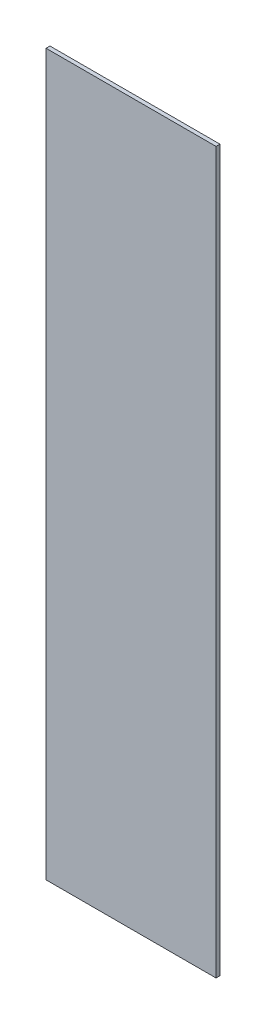
ISO-10303-21;
HEADER;
FILE_DESCRIPTION(('STEP AP214'),'2;1');
FILE_NAME('part.step','',(''),(''),'','','');
FILE_SCHEMA(('AUTOMOTIVE_DESIGN { 1 0 10303 214 1 1 1 1 }'));
ENDSEC;
DATA;
#1=APPLICATION_CONTEXT('core data for automotive mechanical design processes');
#2=APPLICATION_PROTOCOL_DEFINITION('international standard','automotive_design',2000,#1);
#3=PRODUCT_CONTEXT('',#1,'mechanical');
#4=PRODUCT('Part','Part','',(#3));
#5=PRODUCT_RELATED_PRODUCT_CATEGORY('part','',(#4));
#6=PRODUCT_DEFINITION_FORMATION('','',#4);
#7=PRODUCT_DEFINITION_CONTEXT('part definition',#1,'design');
#8=PRODUCT_DEFINITION('design','',#6,#7);
#9=PRODUCT_DEFINITION_SHAPE('','',#8);
#10=(LENGTH_UNIT() NAMED_UNIT(*) SI_UNIT(.MILLI.,.METRE.));
#11=(NAMED_UNIT(*) PLANE_ANGLE_UNIT() SI_UNIT($,.RADIAN.));
#12=(NAMED_UNIT(*) SI_UNIT($,.STERADIAN.) SOLID_ANGLE_UNIT());
#13=UNCERTAINTY_MEASURE_WITH_UNIT(LENGTH_MEASURE(1.E-05),#10,'distance_accuracy_value','');
#14=(GEOMETRIC_REPRESENTATION_CONTEXT(3) GLOBAL_UNCERTAINTY_ASSIGNED_CONTEXT((#13)) GLOBAL_UNIT_ASSIGNED_CONTEXT((#10,
#11,#12)) REPRESENTATION_CONTEXT('',''));
#15=CARTESIAN_POINT('',(0.,0.,0.));
#16=DIRECTION('',(0.,0.,1.));
#17=DIRECTION('',(1.,0.,0.));
#18=AXIS2_PLACEMENT_3D('',#15,#16,#17);
#19=CARTESIAN_POINT('',(216.75,-918.5,10.));
#20=DIRECTION('',(-1.,0.,0.));
#21=DIRECTION('',(0.,0.,1.));
#22=AXIS2_PLACEMENT_3D('',#19,#20,#21);
#23=PLANE('',#22);
#24=DIRECTION('',(0.,1.,0.));
#25=VECTOR('',#24,1.);
#26=CARTESIAN_POINT('',(216.75,-918.5,0.));
#27=LINE('',#26,#25);
#28=CARTESIAN_POINT('',(216.75,-918.5,0.));
#29=VERTEX_POINT('',#28);
#30=CARTESIAN_POINT('',(216.75,918.5,0.));
#31=VERTEX_POINT('',#30);
#32=EDGE_CURVE('E106',#29,#31,#27,.T.);
#33=ORIENTED_EDGE('',*,*,#32,.T.);
#34=DIRECTION('',(0.,0.,-1.));
#35=VECTOR('',#34,1.);
#36=CARTESIAN_POINT('',(216.75,918.5,10.));
#37=LINE('',#36,#35);
#38=CARTESIAN_POINT('',(216.75,918.5,10.));
#39=VERTEX_POINT('',#38);
#40=EDGE_CURVE('E11',#39,#31,#37,.T.);
#41=ORIENTED_EDGE('',*,*,#40,.F.);
#42=DIRECTION('',(0.,1.,0.));
#43=VECTOR('',#42,1.);
#44=CARTESIAN_POINT('',(216.75,-918.5,10.));
#45=LINE('',#44,#43);
#46=CARTESIAN_POINT('',(216.75,-918.5,10.));
#47=VERTEX_POINT('',#46);
#48=EDGE_CURVE('E94',#47,#39,#45,.T.);
#49=ORIENTED_EDGE('',*,*,#48,.F.);
#50=DIRECTION('',(0.,0.,-1.));
#51=VECTOR('',#50,1.);
#52=CARTESIAN_POINT('',(216.75,-918.5,10.));
#53=LINE('',#52,#51);
#54=EDGE_CURVE('E102',#47,#29,#53,.T.);
#55=ORIENTED_EDGE('',*,*,#54,.T.);
#56=EDGE_LOOP('',(#33,#41,#49,#55));
#57=FACE_BOUND('',#56,.T.);
#58=ADVANCED_FACE('F43',(#57),#23,.F.);
#59=CARTESIAN_POINT('',(-216.75,918.5,10.));
#60=DIRECTION('',(0.,-1.,0.));
#61=DIRECTION('',(0.,0.,-1.));
#62=AXIS2_PLACEMENT_3D('',#59,#60,#61);
#63=PLANE('',#62);
#64=DIRECTION('',(-1.,0.,0.));
#65=VECTOR('',#64,1.);
#66=CARTESIAN_POINT('',(-216.75,918.5,0.));
#67=LINE('',#66,#65);
#68=CARTESIAN_POINT('',(-216.75,918.5,0.));
#69=VERTEX_POINT('',#68);
#70=EDGE_CURVE('E98',#31,#69,#67,.T.);
#71=ORIENTED_EDGE('',*,*,#70,.T.);
#72=DIRECTION('',(0.,0.,-1.));
#73=VECTOR('',#72,1.);
#74=CARTESIAN_POINT('',(-216.75,918.5,10.));
#75=LINE('',#74,#73);
#76=CARTESIAN_POINT('',(-216.75,918.5,10.));
#77=VERTEX_POINT('',#76);
#78=EDGE_CURVE('E51',#77,#69,#75,.T.);
#79=ORIENTED_EDGE('',*,*,#78,.F.);
#80=DIRECTION('',(-1.,0.,0.));
#81=VECTOR('',#80,1.);
#82=CARTESIAN_POINT('',(-216.75,918.5,10.));
#83=LINE('',#82,#81);
#84=EDGE_CURVE('E89',#39,#77,#83,.T.);
#85=ORIENTED_EDGE('',*,*,#84,.F.);
#86=ORIENTED_EDGE('',*,*,#40,.T.);
#87=EDGE_LOOP('',(#71,#79,#85,#86));
#88=FACE_BOUND('',#87,.T.);
#89=ADVANCED_FACE('F97',(#88),#63,.F.);
#90=CARTESIAN_POINT('',(-216.75,-918.5,10.));
#91=DIRECTION('',(1.,0.,0.));
#92=DIRECTION('',(0.,0.,-1.));
#93=AXIS2_PLACEMENT_3D('',#90,#91,#92);
#94=PLANE('',#93);
#95=DIRECTION('',(0.,-1.,0.));
#96=VECTOR('',#95,1.);
#97=CARTESIAN_POINT('',(-216.75,-918.5,0.));
#98=LINE('',#97,#96);
#99=CARTESIAN_POINT('',(-216.75,-918.5,0.));
#100=VERTEX_POINT('',#99);
#101=EDGE_CURVE('E76',#69,#100,#98,.T.);
#102=ORIENTED_EDGE('',*,*,#101,.T.);
#103=DIRECTION('',(0.,0.,-1.));
#104=VECTOR('',#103,1.);
#105=CARTESIAN_POINT('',(-216.75,-918.5,10.));
#106=LINE('',#105,#104);
#107=CARTESIAN_POINT('',(-216.75,-918.5,10.));
#108=VERTEX_POINT('',#107);
#109=EDGE_CURVE('E99',#108,#100,#106,.T.);
#110=ORIENTED_EDGE('',*,*,#109,.F.);
#111=DIRECTION('',(0.,-1.,0.));
#112=VECTOR('',#111,1.);
#113=CARTESIAN_POINT('',(-216.75,-918.5,10.));
#114=LINE('',#113,#112);
#115=EDGE_CURVE('E92',#77,#108,#114,.T.);
#116=ORIENTED_EDGE('',*,*,#115,.F.);
#117=ORIENTED_EDGE('',*,*,#78,.T.);
#118=EDGE_LOOP('',(#102,#110,#116,#117));
#119=FACE_BOUND('',#118,.T.);
#120=ADVANCED_FACE('F100',(#119),#94,.F.);
#121=CARTESIAN_POINT('',(-216.75,-918.5,10.));
#122=DIRECTION('',(0.,1.,0.));
#123=DIRECTION('',(0.,0.,1.));
#124=AXIS2_PLACEMENT_3D('',#121,#122,#123);
#125=PLANE('',#124);
#126=DIRECTION('',(1.,0.,0.));
#127=VECTOR('',#126,1.);
#128=CARTESIAN_POINT('',(-216.75,-918.5,0.));
#129=LINE('',#128,#127);
#130=EDGE_CURVE('E82',#100,#29,#129,.T.);
#131=ORIENTED_EDGE('',*,*,#130,.T.);
#132=ORIENTED_EDGE('',*,*,#54,.F.);
#133=DIRECTION('',(1.,0.,0.));
#134=VECTOR('',#133,1.);
#135=CARTESIAN_POINT('',(-216.75,-918.5,10.));
#136=LINE('',#135,#134);
#137=EDGE_CURVE('E59',#108,#47,#136,.T.);
#138=ORIENTED_EDGE('',*,*,#137,.F.);
#139=ORIENTED_EDGE('',*,*,#109,.T.);
#140=EDGE_LOOP('',(#131,#132,#138,#139));
#141=FACE_BOUND('',#140,.T.);
#142=ADVANCED_FACE('F113',(#141),#125,.F.);
#143=CARTESIAN_POINT('',(0.,0.,10.));
#144=DIRECTION('',(0.,0.,-1.));
#145=DIRECTION('',(-1.,0.,0.));
#146=AXIS2_PLACEMENT_3D('',#143,#144,#145);
#147=PLANE('',#146);
#148=ORIENTED_EDGE('',*,*,#48,.T.);
#149=ORIENTED_EDGE('',*,*,#84,.T.);
#150=ORIENTED_EDGE('',*,*,#115,.T.);
#151=ORIENTED_EDGE('',*,*,#137,.T.);
#152=EDGE_LOOP('',(#148,#149,#150,#151));
#153=FACE_BOUND('',#152,.T.);
#154=ADVANCED_FACE('F90',(#153),#147,.F.);
#155=CARTESIAN_POINT('',(0.,0.,0.));
#156=DIRECTION('',(0.,0.,-1.));
#157=DIRECTION('',(-1.,0.,0.));
#158=AXIS2_PLACEMENT_3D('',#155,#156,#157);
#159=PLANE('',#158);
#160=ORIENTED_EDGE('',*,*,#32,.F.);
#161=ORIENTED_EDGE('',*,*,#130,.F.);
#162=ORIENTED_EDGE('',*,*,#101,.F.);
#163=ORIENTED_EDGE('',*,*,#70,.F.);
#164=EDGE_LOOP('',(#160,#161,#162,#163));
#165=FACE_BOUND('',#164,.T.);
#166=ADVANCED_FACE('F116',(#165),#159,.T.);
#167=CLOSED_SHELL('',(#58,#89,#120,#142,#154,#166));
#168=MANIFOLD_SOLID_BREP('B2',#167);
#169=ADVANCED_BREP_SHAPE_REPRESENTATION('',(#18,#168),#14);
#170=SHAPE_DEFINITION_REPRESENTATION(#9,#169);
ENDSEC;
END-ISO-10303-21;
